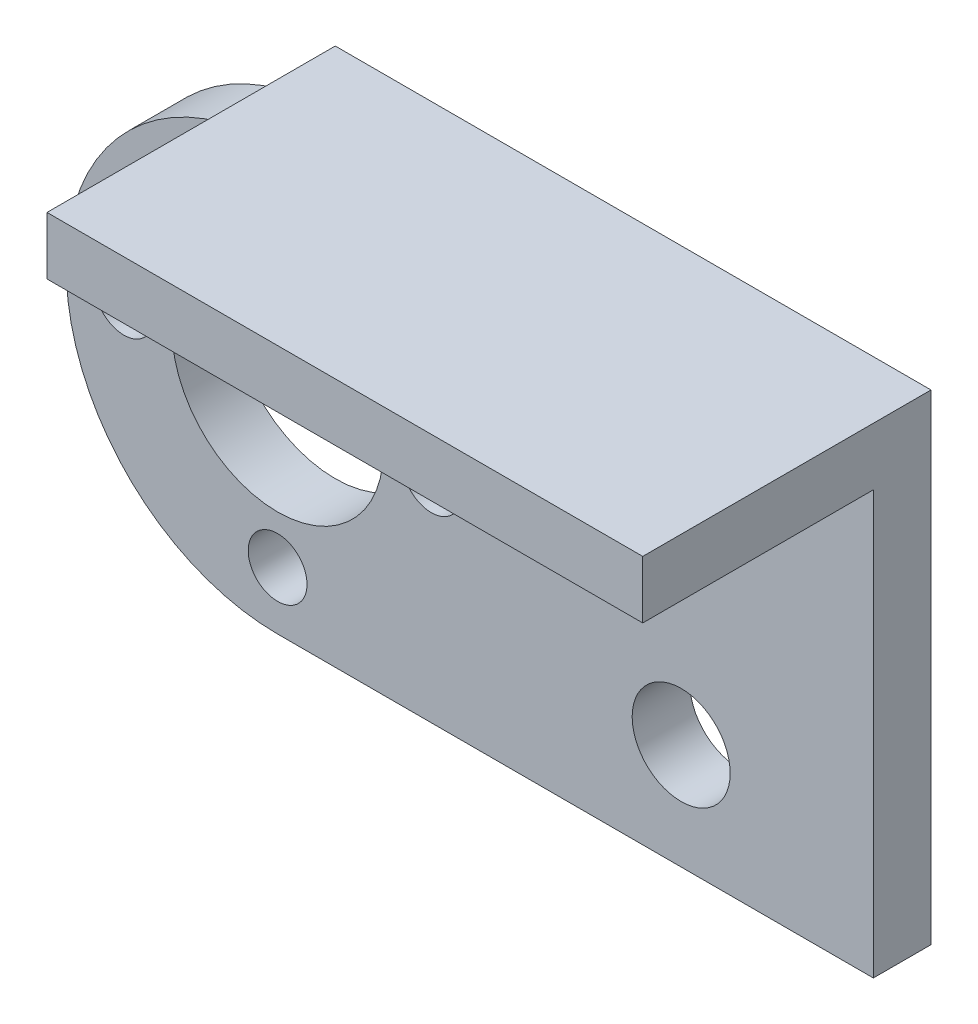
ISO-10303-21;
HEADER;
FILE_DESCRIPTION(('STEP AP214'),'2;1');
FILE_NAME('part.step','',(''),(''),'','','');
FILE_SCHEMA(('AUTOMOTIVE_DESIGN { 1 0 10303 214 1 1 1 1 }'));
ENDSEC;
DATA;
#1=APPLICATION_CONTEXT('core data for automotive mechanical design processes');
#2=APPLICATION_PROTOCOL_DEFINITION('international standard','automotive_design',2000,#1);
#3=PRODUCT_CONTEXT('',#1,'mechanical');
#4=PRODUCT('Part','Part','',(#3));
#5=PRODUCT_RELATED_PRODUCT_CATEGORY('part','',(#4));
#6=PRODUCT_DEFINITION_FORMATION('','',#4);
#7=PRODUCT_DEFINITION_CONTEXT('part definition',#1,'design');
#8=PRODUCT_DEFINITION('design','',#6,#7);
#9=PRODUCT_DEFINITION_SHAPE('','',#8);
#10=(LENGTH_UNIT() NAMED_UNIT(*) SI_UNIT(.MILLI.,.METRE.));
#11=(NAMED_UNIT(*) PLANE_ANGLE_UNIT() SI_UNIT($,.RADIAN.));
#12=(NAMED_UNIT(*) SI_UNIT($,.STERADIAN.) SOLID_ANGLE_UNIT());
#13=UNCERTAINTY_MEASURE_WITH_UNIT(LENGTH_MEASURE(1.E-05),#10,'distance_accuracy_value','');
#14=(GEOMETRIC_REPRESENTATION_CONTEXT(3) GLOBAL_UNCERTAINTY_ASSIGNED_CONTEXT((#13)) GLOBAL_UNIT_ASSIGNED_CONTEXT((#10,
#11,#12)) REPRESENTATION_CONTEXT('',''));
#15=CARTESIAN_POINT('',(0.,0.,0.));
#16=DIRECTION('',(0.,0.,1.));
#17=DIRECTION('',(1.,0.,0.));
#18=AXIS2_PLACEMENT_3D('',#15,#16,#17);
#19=CARTESIAN_POINT('',(0.,0.,3.));
#20=DIRECTION('',(0.,0.,1.));
#21=DIRECTION('',(1.,0.,0.));
#22=AXIS2_PLACEMENT_3D('',#19,#20,#21);
#23=PLANE('',#22);
#24=CARTESIAN_POINT('',(21.,5.5,3.));
#25=DIRECTION('',(0.,0.,1.));
#26=DIRECTION('',(1.,0.,0.));
#27=AXIS2_PLACEMENT_3D('',#24,#25,#26);
#28=CIRCLE('',#27,2.55);
#29=CARTESIAN_POINT('',(23.55,5.5,3.));
#30=VERTEX_POINT('',#29);
#31=EDGE_CURVE('E144',#30,#30,#28,.F.);
#32=ORIENTED_EDGE('',*,*,#31,.T.);
#33=EDGE_LOOP('',(#32));
#34=FACE_BOUND('',#33,.T.);
#35=CARTESIAN_POINT('',(21.,-5.5,3.));
#36=DIRECTION('',(0.,0.,1.));
#37=DIRECTION('',(1.,0.,0.));
#38=AXIS2_PLACEMENT_3D('',#35,#36,#37);
#39=CIRCLE('',#38,2.55);
#40=CARTESIAN_POINT('',(23.55,-5.5,3.));
#41=VERTEX_POINT('',#40);
#42=EDGE_CURVE('E140',#41,#41,#39,.F.);
#43=ORIENTED_EDGE('',*,*,#42,.T.);
#44=EDGE_LOOP('',(#43));
#45=FACE_BOUND('',#44,.T.);
#46=CARTESIAN_POINT('',(4.52787916007828E-13,-8.,3.));
#47=DIRECTION('',(0.,0.,1.));
#48=DIRECTION('',(1.,0.,0.));
#49=AXIS2_PLACEMENT_3D('',#46,#47,#48);
#50=CIRCLE('',#49,1.53000000000049);
#51=CARTESIAN_POINT('',(1.53000000000094,-8.,3.));
#52=VERTEX_POINT('',#51);
#53=EDGE_CURVE('E154',#52,#52,#50,.T.);
#54=ORIENTED_EDGE('',*,*,#53,.F.);
#55=EDGE_LOOP('',(#54));
#56=FACE_BOUND('',#55,.T.);
#57=CARTESIAN_POINT('',(0.,0.,3.));
#58=DIRECTION('',(0.,0.,1.));
#59=DIRECTION('',(1.,0.,0.));
#60=AXIS2_PLACEMENT_3D('',#57,#58,#59);
#61=CIRCLE('',#60,5.5);
#62=CARTESIAN_POINT('',(5.5,0.,3.));
#63=VERTEX_POINT('',#62);
#64=EDGE_CURVE('E166',#63,#63,#61,.T.);
#65=ORIENTED_EDGE('',*,*,#64,.F.);
#66=EDGE_LOOP('',(#65));
#67=FACE_BOUND('',#66,.T.);
#68=DIRECTION('',(-1.,0.,0.));
#69=VECTOR('',#68,1.);
#70=CARTESIAN_POINT('',(11.,11.,3.));
#71=LINE('',#70,#69);
#72=CARTESIAN_POINT('',(31.,11.,3.));
#73=VERTEX_POINT('',#72);
#74=CARTESIAN_POINT('',(-1.,11.,3.));
#75=VERTEX_POINT('',#74);
#76=EDGE_CURVE('E61',#73,#75,#71,.T.);
#77=ORIENTED_EDGE('',*,*,#76,.T.);
#78=DIRECTION('',(0.,-1.,0.));
#79=VECTOR('',#78,1.);
#80=CARTESIAN_POINT('',(-1.,0.,3.));
#81=LINE('',#80,#79);
#82=CARTESIAN_POINT('',(-0.999999999999999,11.7881900181363,3.));
#83=VERTEX_POINT('',#82);
#84=EDGE_CURVE('E204',#75,#83,#81,.F.);
#85=ORIENTED_EDGE('',*,*,#84,.T.);
#86=CARTESIAN_POINT('',(-3.97296347522982,14.4642857142857,3.));
#87=DIRECTION('',(0.,0.,1.));
#88=DIRECTION('',(1.,0.,0.));
#89=AXIS2_PLACEMENT_3D('',#86,#87,#88);
#90=CIRCLE('',#89,4.);
#91=CARTESIAN_POINT('',(-2.91350654850187,10.6071428571429,3.));
#92=VERTEX_POINT('',#91);
#93=EDGE_CURVE('E199',#83,#92,#90,.F.);
#94=ORIENTED_EDGE('',*,*,#93,.T.);
#95=CARTESIAN_POINT('',(0.,0.,3.));
#96=DIRECTION('',(0.,0.,1.));
#97=DIRECTION('',(1.,0.,0.));
#98=AXIS2_PLACEMENT_3D('',#95,#96,#97);
#99=CIRCLE('',#98,11.);
#100=CARTESIAN_POINT('',(0.,-11.,3.));
#101=VERTEX_POINT('',#100);
#102=EDGE_CURVE('E178',#92,#101,#99,.T.);
#103=ORIENTED_EDGE('',*,*,#102,.T.);
#104=DIRECTION('',(1.,0.,0.));
#105=VECTOR('',#104,1.);
#106=CARTESIAN_POINT('',(0.,-11.,3.));
#107=LINE('',#106,#105);
#108=CARTESIAN_POINT('',(31.,-11.,3.));
#109=VERTEX_POINT('',#108);
#110=EDGE_CURVE('E180',#101,#109,#107,.T.);
#111=ORIENTED_EDGE('',*,*,#110,.T.);
#112=DIRECTION('',(0.,1.,0.));
#113=VECTOR('',#112,1.);
#114=CARTESIAN_POINT('',(31.,-11.,3.));
#115=LINE('',#114,#113);
#116=EDGE_CURVE('E182',#109,#73,#115,.T.);
#117=ORIENTED_EDGE('',*,*,#116,.T.);
#118=EDGE_LOOP('',(#77,#85,#94,#103,#111,#117));
#119=FACE_BOUND('',#118,.T.);
#120=CARTESIAN_POINT('',(0.,8.,3.));
#121=DIRECTION('',(0.,0.,1.));
#122=DIRECTION('',(1.,0.,0.));
#123=AXIS2_PLACEMENT_3D('',#120,#121,#122);
#124=CIRCLE('',#123,1.53);
#125=CARTESIAN_POINT('',(1.53,8.,3.));
#126=VERTEX_POINT('',#125);
#127=EDGE_CURVE('E172',#126,#126,#124,.T.);
#128=ORIENTED_EDGE('',*,*,#127,.F.);
#129=EDGE_LOOP('',(#128));
#130=FACE_BOUND('',#129,.T.);
#131=CARTESIAN_POINT('',(8.,0.,3.));
#132=DIRECTION('',(0.,0.,1.));
#133=DIRECTION('',(1.,0.,0.));
#134=AXIS2_PLACEMENT_3D('',#131,#132,#133);
#135=CIRCLE('',#134,1.53);
#136=CARTESIAN_POINT('',(9.53,0.,3.));
#137=VERTEX_POINT('',#136);
#138=EDGE_CURVE('E160',#137,#137,#135,.T.);
#139=ORIENTED_EDGE('',*,*,#138,.F.);
#140=EDGE_LOOP('',(#139));
#141=FACE_BOUND('',#140,.T.);
#142=CARTESIAN_POINT('',(-8.,0.,3.));
#143=DIRECTION('',(0.,0.,1.));
#144=DIRECTION('',(1.,0.,0.));
#145=AXIS2_PLACEMENT_3D('',#142,#143,#144);
#146=CIRCLE('',#145,1.53);
#147=CARTESIAN_POINT('',(-6.47,0.,3.));
#148=VERTEX_POINT('',#147);
#149=EDGE_CURVE('E148',#148,#148,#146,.T.);
#150=ORIENTED_EDGE('',*,*,#149,.F.);
#151=EDGE_LOOP('',(#150));
#152=FACE_BOUND('',#151,.T.);
#153=ADVANCED_FACE('F33',(#34,#45,#56,#67,#119,#130,#141,#152),#23,.T.);
#154=CARTESIAN_POINT('',(0.,0.,0.));
#155=DIRECTION('',(0.,0.,1.));
#156=DIRECTION('',(1.,0.,0.));
#157=AXIS2_PLACEMENT_3D('',#154,#155,#156);
#158=PLANE('',#157);
#159=CARTESIAN_POINT('',(21.,5.5,0.));
#160=DIRECTION('',(0.,0.,1.));
#161=DIRECTION('',(1.,0.,0.));
#162=AXIS2_PLACEMENT_3D('',#159,#160,#161);
#163=CIRCLE('',#162,2.55);
#164=CARTESIAN_POINT('',(23.55,5.5,0.));
#165=VERTEX_POINT('',#164);
#166=EDGE_CURVE('E134',#165,#165,#163,.T.);
#167=ORIENTED_EDGE('',*,*,#166,.T.);
#168=EDGE_LOOP('',(#167));
#169=FACE_BOUND('',#168,.T.);
#170=CARTESIAN_POINT('',(21.,-5.5,0.));
#171=DIRECTION('',(0.,0.,1.));
#172=DIRECTION('',(-1.,0.,0.));
#173=AXIS2_PLACEMENT_3D('',#170,#171,#172);
#174=CIRCLE('',#173,2.55);
#175=CARTESIAN_POINT('',(18.45,-5.5,0.));
#176=VERTEX_POINT('',#175);
#177=EDGE_CURVE('E131',#176,#176,#174,.T.);
#178=ORIENTED_EDGE('',*,*,#177,.T.);
#179=EDGE_LOOP('',(#178));
#180=FACE_BOUND('',#179,.T.);
#181=CARTESIAN_POINT('',(0.,0.,0.));
#182=DIRECTION('',(0.,0.,1.));
#183=DIRECTION('',(1.,0.,0.));
#184=AXIS2_PLACEMENT_3D('',#181,#182,#183);
#185=CIRCLE('',#184,11.);
#186=CARTESIAN_POINT('',(-2.91350654850187,10.6071428571429,0.));
#187=VERTEX_POINT('',#186);
#188=CARTESIAN_POINT('',(0.,-11.,0.));
#189=VERTEX_POINT('',#188);
#190=EDGE_CURVE('E175',#187,#189,#185,.T.);
#191=ORIENTED_EDGE('',*,*,#190,.F.);
#192=CARTESIAN_POINT('',(-3.97296347522982,14.4642857142857,0.));
#193=DIRECTION('',(0.,0.,1.));
#194=DIRECTION('',(1.,0.,0.));
#195=AXIS2_PLACEMENT_3D('',#192,#193,#194);
#196=CIRCLE('',#195,4.);
#197=CARTESIAN_POINT('',(0.,14.,0.));
#198=VERTEX_POINT('',#197);
#199=EDGE_CURVE('E197',#187,#198,#196,.T.);
#200=ORIENTED_EDGE('',*,*,#199,.T.);
#201=DIRECTION('',(-1.,0.,0.));
#202=VECTOR('',#201,1.);
#203=CARTESIAN_POINT('',(31.,14.,0.));
#204=LINE('',#203,#202);
#205=CARTESIAN_POINT('',(31.,14.,0.));
#206=VERTEX_POINT('',#205);
#207=EDGE_CURVE('E124',#206,#198,#204,.T.);
#208=ORIENTED_EDGE('',*,*,#207,.F.);
#209=DIRECTION('',(0.,1.,0.));
#210=VECTOR('',#209,1.);
#211=CARTESIAN_POINT('',(31.,-11.,0.));
#212=LINE('',#211,#210);
#213=CARTESIAN_POINT('',(31.,-11.,0.));
#214=VERTEX_POINT('',#213);
#215=EDGE_CURVE('E129',#214,#206,#212,.T.);
#216=ORIENTED_EDGE('',*,*,#215,.F.);
#217=DIRECTION('',(1.,0.,0.));
#218=VECTOR('',#217,1.);
#219=CARTESIAN_POINT('',(11.,-11.,0.));
#220=LINE('',#219,#218);
#221=EDGE_CURVE('E187',#189,#214,#220,.T.);
#222=ORIENTED_EDGE('',*,*,#221,.F.);
#223=EDGE_LOOP('',(#191,#200,#208,#216,#222));
#224=FACE_BOUND('',#223,.T.);
#225=CARTESIAN_POINT('',(0.,8.,0.));
#226=DIRECTION('',(0.,0.,1.));
#227=DIRECTION('',(1.,0.,0.));
#228=AXIS2_PLACEMENT_3D('',#225,#226,#227);
#229=CIRCLE('',#228,1.53);
#230=CARTESIAN_POINT('',(1.53,8.,0.));
#231=VERTEX_POINT('',#230);
#232=EDGE_CURVE('E169',#231,#231,#229,.T.);
#233=ORIENTED_EDGE('',*,*,#232,.T.);
#234=EDGE_LOOP('',(#233));
#235=FACE_BOUND('',#234,.T.);
#236=CARTESIAN_POINT('',(0.,0.,0.));
#237=DIRECTION('',(0.,0.,1.));
#238=DIRECTION('',(1.,0.,0.));
#239=AXIS2_PLACEMENT_3D('',#236,#237,#238);
#240=CIRCLE('',#239,5.5);
#241=CARTESIAN_POINT('',(5.5,0.,0.));
#242=VERTEX_POINT('',#241);
#243=EDGE_CURVE('E163',#242,#242,#240,.T.);
#244=ORIENTED_EDGE('',*,*,#243,.T.);
#245=EDGE_LOOP('',(#244));
#246=FACE_BOUND('',#245,.T.);
#247=CARTESIAN_POINT('',(8.,0.,0.));
#248=DIRECTION('',(0.,0.,1.));
#249=DIRECTION('',(1.,0.,0.));
#250=AXIS2_PLACEMENT_3D('',#247,#248,#249);
#251=CIRCLE('',#250,1.53);
#252=CARTESIAN_POINT('',(9.53,0.,0.));
#253=VERTEX_POINT('',#252);
#254=EDGE_CURVE('E157',#253,#253,#251,.T.);
#255=ORIENTED_EDGE('',*,*,#254,.T.);
#256=EDGE_LOOP('',(#255));
#257=FACE_BOUND('',#256,.T.);
#258=CARTESIAN_POINT('',(4.52787916007828E-13,-8.,0.));
#259=DIRECTION('',(0.,0.,1.));
#260=DIRECTION('',(1.,0.,0.));
#261=AXIS2_PLACEMENT_3D('',#258,#259,#260);
#262=CIRCLE('',#261,1.53000000000049);
#263=CARTESIAN_POINT('',(1.53000000000094,-8.,0.));
#264=VERTEX_POINT('',#263);
#265=EDGE_CURVE('E151',#264,#264,#262,.T.);
#266=ORIENTED_EDGE('',*,*,#265,.T.);
#267=EDGE_LOOP('',(#266));
#268=FACE_BOUND('',#267,.T.);
#269=CARTESIAN_POINT('',(-8.,0.,0.));
#270=DIRECTION('',(0.,0.,1.));
#271=DIRECTION('',(1.,0.,0.));
#272=AXIS2_PLACEMENT_3D('',#269,#270,#271);
#273=CIRCLE('',#272,1.53);
#274=CARTESIAN_POINT('',(-6.47,0.,0.));
#275=VERTEX_POINT('',#274);
#276=EDGE_CURVE('E147',#275,#275,#273,.T.);
#277=ORIENTED_EDGE('',*,*,#276,.T.);
#278=EDGE_LOOP('',(#277));
#279=FACE_BOUND('',#278,.T.);
#280=ADVANCED_FACE('F226',(#169,#180,#224,#235,#246,#257,#268,#279),#158,.F.);
#281=CARTESIAN_POINT('',(0.,0.,3.));
#282=DIRECTION('',(0.,0.,-1.));
#283=DIRECTION('',(-1.,0.,0.));
#284=AXIS2_PLACEMENT_3D('',#281,#282,#283);
#285=CYLINDRICAL_SURFACE('',#284,11.);
#286=ORIENTED_EDGE('',*,*,#102,.F.);
#287=DIRECTION('',(0.,0.,-1.));
#288=VECTOR('',#287,1.);
#289=CARTESIAN_POINT('',(-2.91350654850187,10.6071428571429,3.));
#290=LINE('',#289,#288);
#291=EDGE_CURVE('E194',#92,#187,#290,.T.);
#292=ORIENTED_EDGE('',*,*,#291,.T.);
#293=ORIENTED_EDGE('',*,*,#190,.T.);
#294=DIRECTION('',(0.,0.,-1.));
#295=VECTOR('',#294,1.);
#296=CARTESIAN_POINT('',(0.,-11.,3.));
#297=LINE('',#296,#295);
#298=EDGE_CURVE('E191',#101,#189,#297,.T.);
#299=ORIENTED_EDGE('',*,*,#298,.F.);
#300=EDGE_LOOP('',(#286,#292,#293,#299));
#301=FACE_BOUND('',#300,.T.);
#302=ADVANCED_FACE('F222',(#301),#285,.T.);
#303=CARTESIAN_POINT('',(11.,-11.,3.));
#304=DIRECTION('',(0.,1.,0.));
#305=DIRECTION('',(0.,0.,1.));
#306=AXIS2_PLACEMENT_3D('',#303,#304,#305);
#307=PLANE('',#306);
#308=ORIENTED_EDGE('',*,*,#221,.T.);
#309=DIRECTION('',(0.,0.,-1.));
#310=VECTOR('',#309,1.);
#311=CARTESIAN_POINT('',(31.,-11.,3.));
#312=LINE('',#311,#310);
#313=EDGE_CURVE('E185',#109,#214,#312,.T.);
#314=ORIENTED_EDGE('',*,*,#313,.F.);
#315=ORIENTED_EDGE('',*,*,#110,.F.);
#316=ORIENTED_EDGE('',*,*,#298,.T.);
#317=EDGE_LOOP('',(#308,#314,#315,#316));
#318=FACE_BOUND('',#317,.T.);
#319=ADVANCED_FACE('F231',(#318),#307,.F.);
#320=CARTESIAN_POINT('',(31.,-11.,3.));
#321=DIRECTION('',(-1.,0.,0.));
#322=DIRECTION('',(0.,0.,1.));
#323=AXIS2_PLACEMENT_3D('',#320,#321,#322);
#324=PLANE('',#323);
#325=ORIENTED_EDGE('',*,*,#215,.T.);
#326=DIRECTION('',(0.,0.,-1.));
#327=VECTOR('',#326,1.);
#328=CARTESIAN_POINT('',(31.,14.,15.));
#329=LINE('',#328,#327);
#330=CARTESIAN_POINT('',(31.,14.,15.));
#331=VERTEX_POINT('',#330);
#332=EDGE_CURVE('E110',#331,#206,#329,.T.);
#333=ORIENTED_EDGE('',*,*,#332,.F.);
#334=DIRECTION('',(0.,1.,0.));
#335=VECTOR('',#334,1.);
#336=CARTESIAN_POINT('',(31.,11.,15.));
#337=LINE('',#336,#335);
#338=CARTESIAN_POINT('',(31.,11.,15.));
#339=VERTEX_POINT('',#338);
#340=EDGE_CURVE('E115',#339,#331,#337,.T.);
#341=ORIENTED_EDGE('',*,*,#340,.F.);
#342=DIRECTION('',(0.,0.,-1.));
#343=VECTOR('',#342,1.);
#344=CARTESIAN_POINT('',(31.,11.,15.));
#345=LINE('',#344,#343);
#346=EDGE_CURVE('E233',#339,#73,#345,.T.);
#347=ORIENTED_EDGE('',*,*,#346,.T.);
#348=ORIENTED_EDGE('',*,*,#116,.F.);
#349=ORIENTED_EDGE('',*,*,#313,.T.);
#350=EDGE_LOOP('',(#325,#333,#341,#347,#348,#349));
#351=FACE_BOUND('',#350,.T.);
#352=ADVANCED_FACE('F126',(#351),#324,.F.);
#353=CARTESIAN_POINT('',(0.,8.,3.));
#354=DIRECTION('',(0.,0.,-1.));
#355=DIRECTION('',(-1.,0.,0.));
#356=AXIS2_PLACEMENT_3D('',#353,#354,#355);
#357=CYLINDRICAL_SURFACE('',#356,1.53);
#358=ORIENTED_EDGE('',*,*,#127,.T.);
#359=EDGE_LOOP('',(#358));
#360=FACE_BOUND('',#359,.T.);
#361=ORIENTED_EDGE('',*,*,#232,.F.);
#362=EDGE_LOOP('',(#361));
#363=FACE_BOUND('',#362,.T.);
#364=ADVANCED_FACE('F259',(#360,#363),#357,.F.);
#365=CARTESIAN_POINT('',(0.,0.,3.));
#366=DIRECTION('',(0.,0.,-1.));
#367=DIRECTION('',(-1.,0.,0.));
#368=AXIS2_PLACEMENT_3D('',#365,#366,#367);
#369=CYLINDRICAL_SURFACE('',#368,5.5);
#370=ORIENTED_EDGE('',*,*,#64,.T.);
#371=EDGE_LOOP('',(#370));
#372=FACE_BOUND('',#371,.T.);
#373=ORIENTED_EDGE('',*,*,#243,.F.);
#374=EDGE_LOOP('',(#373));
#375=FACE_BOUND('',#374,.T.);
#376=ADVANCED_FACE('F383',(#372,#375),#369,.F.);
#377=CARTESIAN_POINT('',(8.,0.,3.));
#378=DIRECTION('',(0.,0.,-1.));
#379=DIRECTION('',(-1.,0.,0.));
#380=AXIS2_PLACEMENT_3D('',#377,#378,#379);
#381=CYLINDRICAL_SURFACE('',#380,1.53);
#382=ORIENTED_EDGE('',*,*,#138,.T.);
#383=EDGE_LOOP('',(#382));
#384=FACE_BOUND('',#383,.T.);
#385=ORIENTED_EDGE('',*,*,#254,.F.);
#386=EDGE_LOOP('',(#385));
#387=FACE_BOUND('',#386,.T.);
#388=ADVANCED_FACE('F373',(#384,#387),#381,.F.);
#389=CARTESIAN_POINT('',(4.52787916007828E-13,-8.,3.));
#390=DIRECTION('',(0.,0.,-1.));
#391=DIRECTION('',(-1.,0.,0.));
#392=AXIS2_PLACEMENT_3D('',#389,#390,#391);
#393=CYLINDRICAL_SURFACE('',#392,1.53000000000049);
#394=ORIENTED_EDGE('',*,*,#53,.T.);
#395=EDGE_LOOP('',(#394));
#396=FACE_BOUND('',#395,.T.);
#397=ORIENTED_EDGE('',*,*,#265,.F.);
#398=EDGE_LOOP('',(#397));
#399=FACE_BOUND('',#398,.T.);
#400=ADVANCED_FACE('F363',(#396,#399),#393,.F.);
#401=CARTESIAN_POINT('',(-8.,0.,3.));
#402=DIRECTION('',(0.,0.,-1.));
#403=DIRECTION('',(-1.,0.,0.));
#404=AXIS2_PLACEMENT_3D('',#401,#402,#403);
#405=CYLINDRICAL_SURFACE('',#404,1.53);
#406=ORIENTED_EDGE('',*,*,#149,.T.);
#407=EDGE_LOOP('',(#406));
#408=FACE_BOUND('',#407,.T.);
#409=ORIENTED_EDGE('',*,*,#276,.F.);
#410=EDGE_LOOP('',(#409));
#411=FACE_BOUND('',#410,.T.);
#412=ADVANCED_FACE('F353',(#408,#411),#405,.F.);
#413=CARTESIAN_POINT('',(21.,-5.5,10.));
#414=DIRECTION('',(0.,0.,-1.));
#415=DIRECTION('',(-1.,0.,0.));
#416=AXIS2_PLACEMENT_3D('',#413,#414,#415);
#417=CYLINDRICAL_SURFACE('',#416,2.55);
#418=ORIENTED_EDGE('',*,*,#42,.F.);
#419=EDGE_LOOP('',(#418));
#420=FACE_BOUND('',#419,.T.);
#421=ORIENTED_EDGE('',*,*,#177,.F.);
#422=EDGE_LOOP('',(#421));
#423=FACE_BOUND('',#422,.T.);
#424=ADVANCED_FACE('F346',(#420,#423),#417,.F.);
#425=CARTESIAN_POINT('',(21.,5.5,10.));
#426=DIRECTION('',(0.,0.,-1.));
#427=DIRECTION('',(-1.,0.,0.));
#428=AXIS2_PLACEMENT_3D('',#425,#426,#427);
#429=CYLINDRICAL_SURFACE('',#428,2.55);
#430=ORIENTED_EDGE('',*,*,#31,.F.);
#431=EDGE_LOOP('',(#430));
#432=FACE_BOUND('',#431,.T.);
#433=ORIENTED_EDGE('',*,*,#166,.F.);
#434=EDGE_LOOP('',(#433));
#435=FACE_BOUND('',#434,.T.);
#436=ADVANCED_FACE('F247',(#432,#435),#429,.F.);
#437=CARTESIAN_POINT('',(31.,14.,15.));
#438=DIRECTION('',(0.,-1.,0.));
#439=DIRECTION('',(1.,0.,0.));
#440=AXIS2_PLACEMENT_3D('',#437,#438,#439);
#441=PLANE('',#440);
#442=ORIENTED_EDGE('',*,*,#207,.T.);
#443=DIRECTION('',(0.,0.,-1.));
#444=VECTOR('',#443,1.);
#445=CARTESIAN_POINT('',(0.,14.,15.));
#446=LINE('',#445,#444);
#447=CARTESIAN_POINT('',(0.,14.,4.));
#448=VERTEX_POINT('',#447);
#449=EDGE_CURVE('E53',#448,#198,#446,.T.);
#450=ORIENTED_EDGE('',*,*,#449,.F.);
#451=CARTESIAN_POINT('',(0.,14.,15.));
#452=VERTEX_POINT('',#451);
#453=EDGE_CURVE('E111',#452,#448,#446,.T.);
#454=ORIENTED_EDGE('',*,*,#453,.F.);
#455=DIRECTION('',(-1.,0.,0.));
#456=VECTOR('',#455,1.);
#457=CARTESIAN_POINT('',(31.,14.,15.));
#458=LINE('',#457,#456);
#459=EDGE_CURVE('E106',#331,#452,#458,.T.);
#460=ORIENTED_EDGE('',*,*,#459,.F.);
#461=ORIENTED_EDGE('',*,*,#332,.T.);
#462=EDGE_LOOP('',(#442,#450,#454,#460,#461));
#463=FACE_BOUND('',#462,.T.);
#464=ADVANCED_FACE('F108',(#463),#441,.F.);
#465=CARTESIAN_POINT('',(0.,11.,15.));
#466=DIRECTION('',(1.,0.,0.));
#467=DIRECTION('',(0.,1.,0.));
#468=AXIS2_PLACEMENT_3D('',#465,#466,#467);
#469=PLANE('',#468);
#470=ORIENTED_EDGE('',*,*,#453,.T.);
#471=DIRECTION('',(0.,-1.,0.));
#472=VECTOR('',#471,1.);
#473=CARTESIAN_POINT('',(0.,11.,4.));
#474=LINE('',#473,#472);
#475=CARTESIAN_POINT('',(0.,11.,4.));
#476=VERTEX_POINT('',#475);
#477=EDGE_CURVE('E201',#448,#476,#474,.T.);
#478=ORIENTED_EDGE('',*,*,#477,.T.);
#479=DIRECTION('',(0.,0.,-1.));
#480=VECTOR('',#479,1.);
#481=CARTESIAN_POINT('',(0.,11.,15.));
#482=LINE('',#481,#480);
#483=CARTESIAN_POINT('',(0.,11.,15.));
#484=VERTEX_POINT('',#483);
#485=EDGE_CURVE('E210',#484,#476,#482,.T.);
#486=ORIENTED_EDGE('',*,*,#485,.F.);
#487=DIRECTION('',(0.,-1.,0.));
#488=VECTOR('',#487,1.);
#489=CARTESIAN_POINT('',(0.,11.,15.));
#490=LINE('',#489,#488);
#491=EDGE_CURVE('E114',#452,#484,#490,.T.);
#492=ORIENTED_EDGE('',*,*,#491,.F.);
#493=EDGE_LOOP('',(#470,#478,#486,#492));
#494=FACE_BOUND('',#493,.T.);
#495=ADVANCED_FACE('F239',(#494),#469,.F.);
#496=CARTESIAN_POINT('',(31.,11.,15.));
#497=DIRECTION('',(0.,1.,0.));
#498=DIRECTION('',(0.,0.,1.));
#499=AXIS2_PLACEMENT_3D('',#496,#497,#498);
#500=PLANE('',#499);
#501=ORIENTED_EDGE('',*,*,#76,.F.);
#502=ORIENTED_EDGE('',*,*,#346,.F.);
#503=DIRECTION('',(1.,0.,0.));
#504=VECTOR('',#503,1.);
#505=CARTESIAN_POINT('',(31.,11.,15.));
#506=LINE('',#505,#504);
#507=EDGE_CURVE('E120',#484,#339,#506,.T.);
#508=ORIENTED_EDGE('',*,*,#507,.F.);
#509=ORIENTED_EDGE('',*,*,#485,.T.);
#510=CARTESIAN_POINT('',(-1.,11.,4.));
#511=DIRECTION('',(0.,1.,0.));
#512=DIRECTION('',(0.,0.,1.));
#513=AXIS2_PLACEMENT_3D('',#510,#511,#512);
#514=CIRCLE('',#513,1.);
#515=EDGE_CURVE('E46',#476,#75,#514,.T.);
#516=ORIENTED_EDGE('',*,*,#515,.T.);
#517=EDGE_LOOP('',(#501,#502,#508,#509,#516));
#518=FACE_BOUND('',#517,.T.);
#519=ADVANCED_FACE('F208',(#518),#500,.F.);
#520=CARTESIAN_POINT('',(0.,0.,15.));
#521=DIRECTION('',(0.,0.,1.));
#522=DIRECTION('',(1.,0.,0.));
#523=AXIS2_PLACEMENT_3D('',#520,#521,#522);
#524=PLANE('',#523);
#525=ORIENTED_EDGE('',*,*,#340,.T.);
#526=ORIENTED_EDGE('',*,*,#459,.T.);
#527=ORIENTED_EDGE('',*,*,#491,.T.);
#528=ORIENTED_EDGE('',*,*,#507,.T.);
#529=EDGE_LOOP('',(#525,#526,#527,#528));
#530=FACE_BOUND('',#529,.T.);
#531=ADVANCED_FACE('F118',(#530),#524,.T.);
#532=CARTESIAN_POINT('',(-3.97296347522982,14.4642857142857,15.));
#533=DIRECTION('',(0.,0.,1.));
#534=DIRECTION('',(1.,0.,0.));
#535=AXIS2_PLACEMENT_3D('',#532,#533,#534);
#536=CYLINDRICAL_SURFACE('',#535,4.);
#537=ORIENTED_EDGE('',*,*,#93,.F.);
#538=CARTESIAN_POINT('',(-1.,11.7881900181363,3.));
#539=CARTESIAN_POINT('',(-0.957310418923033,11.8356009167763,3.0000209547865));
#540=CARTESIAN_POINT('',(-0.915810892513156,11.8839991749135,3.00273110803888));
#541=CARTESIAN_POINT('',(-0.835455989510756,11.9823408555421,3.01279621347713));
#542=CARTESIAN_POINT('',(-0.796595901042265,12.0322812799661,3.02014263407977));
#543=CARTESIAN_POINT('',(-0.72180509795973,12.1332123451827,3.03870758929789));
#544=CARTESIAN_POINT('',(-0.685861265555409,12.1841968229267,3.04990744230809));
#545=CARTESIAN_POINT('',(-0.616736712577769,12.2872252737632,3.07562452051424));
#546=CARTESIAN_POINT('',(-0.583557706533387,12.3392698797369,3.09014378356475));
#547=CARTESIAN_POINT('',(-0.503566118362082,12.4713137410621,3.13025054361946));
#548=CARTESIAN_POINT('',(-0.458569939069338,12.5518588791733,3.15768013093723));
#549=CARTESIAN_POINT('',(-0.374920906932876,12.7143017768313,3.21774103129759));
#550=CARTESIAN_POINT('',(-0.336271146003331,12.7962001744143,3.25037486462773));
#551=CARTESIAN_POINT('',(-0.265112976600694,12.9609850156437,3.3199840503664));
#552=CARTESIAN_POINT('',(-0.232614930350792,13.0438728807354,3.35696656100194));
#553=CARTESIAN_POINT('',(-0.173687194806251,13.2099915535078,3.43467625818262));
#554=CARTESIAN_POINT('',(-0.147254175123376,13.2932221473079,3.47540137232317));
#555=CARTESIAN_POINT('',(-0.112098950843844,13.4175899042792,3.53933044322277));
#556=CARTESIAN_POINT('',(-0.101149870063037,13.4588707239201,3.5610599158125));
#557=CARTESIAN_POINT('',(-0.0807135442224716,13.5411475137918,3.60564580655402));
#558=CARTESIAN_POINT('',(-0.071225185100598,13.5821436781059,3.62850134813719));
#559=CARTESIAN_POINT('',(-0.0566210098354129,13.650017785669,3.66785791286787));
#560=CARTESIAN_POINT('',(-0.0511014679080348,13.6770498784658,3.68393975928812));
#561=CARTESIAN_POINT('',(-0.0407234301058982,13.730639916487,3.71700449698154));
#562=CARTESIAN_POINT('',(-0.0358643239558664,13.7571982794684,3.73398653597856));
#563=CARTESIAN_POINT('',(-0.0253277090051286,13.818220642484,3.77502852610377));
#564=CARTESIAN_POINT('',(-0.0199039366568872,13.8524228042737,3.79958404707196));
#565=CARTESIAN_POINT('',(-0.0127702505160171,13.9011255550358,3.84011123468917));
#566=CARTESIAN_POINT('',(-0.0105499730844298,13.9170062811756,3.85432435322874));
#567=CARTESIAN_POINT('',(-0.00654520872130393,13.9468459952678,3.88473801313493));
#568=CARTESIAN_POINT('',(-0.00475846734143162,13.9608147526504,3.90092758494737));
#569=CARTESIAN_POINT('',(-0.00274000489134293,13.9771010221533,3.92569928815018));
#570=CARTESIAN_POINT('',(-0.00222174991802274,13.9813523622472,3.93295297661148));
#571=CARTESIAN_POINT('',(-0.00132605035387086,13.9887758210593,3.94797302293289));
#572=CARTESIAN_POINT('',(-0.000947855530612237,13.9919536815744,3.95573637913003));
#573=CARTESIAN_POINT('',(-0.000446383740466251,13.9961922054831,3.96956464996557));
#574=CARTESIAN_POINT('',(-0.000281843975074983,13.9975928886393,3.97552193020221));
#575=CARTESIAN_POINT('',(-5.73347918435563E-05,13.9995092921486,3.98764571180526));
#576=CARTESIAN_POINT('',(1.42976574830471E-06,14.0000148149023,3.99381381820171));
#577=CARTESIAN_POINT('',(0.,14.,4.));
#578=B_SPLINE_CURVE_WITH_KNOTS('',3,(#538,#539,#540,#541,#542,#543,#544,#545,#546,#547,#548,
#549,#550,#551,#552,#553,#554,#555,#556,#557,#558,#559,#560,#561,#562,#563,#564,#565,#566,#567,
#568,#569,#570,#571,#572,#573,#574,#575,#576,#577),.UNSPECIFIED.,.F.,.F.,(4,2,2,2,2,2,2,2,2,2,2,
2,2,2,2,2,2,2,2,4),(0.,0.191229858976569,0.382108841912741,0.572075178978952,0.762158454984652,
1.05048331560345,1.33894823121341,1.62789480844229,1.91668233943894,2.06040942707517,
2.20402634811112,2.29980582836238,2.39549619303255,2.52254917316895,2.58678500448466,
2.65067927540624,2.67589003184636,2.70096372365227,2.71926485554476,2.7377731629075),.UNSPECIFIED.);
#579=EDGE_CURVE('E11',#83,#448,#578,.T.);
#580=ORIENTED_EDGE('',*,*,#579,.T.);
#581=ORIENTED_EDGE('',*,*,#449,.T.);
#582=ORIENTED_EDGE('',*,*,#199,.F.);
#583=ORIENTED_EDGE('',*,*,#291,.F.);
#584=EDGE_LOOP('',(#537,#580,#581,#582,#583));
#585=FACE_BOUND('',#584,.T.);
#586=ADVANCED_FACE('F219',(#585),#536,.F.);
#587=CARTESIAN_POINT('',(-1.,11.,4.));
#588=DIRECTION('',(0.,-1.,0.));
#589=DIRECTION('',(1.,0.,0.));
#590=AXIS2_PLACEMENT_3D('',#587,#588,#589);
#591=CYLINDRICAL_SURFACE('',#590,1.);
#592=ORIENTED_EDGE('',*,*,#579,.F.);
#593=ORIENTED_EDGE('',*,*,#84,.F.);
#594=ORIENTED_EDGE('',*,*,#515,.F.);
#595=ORIENTED_EDGE('',*,*,#477,.F.);
#596=EDGE_LOOP('',(#592,#593,#594,#595));
#597=FACE_BOUND('',#596,.T.);
#598=ADVANCED_FACE('F35',(#597),#591,.F.);
#599=CLOSED_SHELL('',(#153,#280,#302,#319,#352,#364,#376,#388,#400,#412,#424,#436,#464,#495,
#519,#531,#586,#598));
#600=MANIFOLD_SOLID_BREP('B2',#599);
#601=ADVANCED_BREP_SHAPE_REPRESENTATION('',(#18,#600),#14);
#602=SHAPE_DEFINITION_REPRESENTATION(#9,#601);
ENDSEC;
END-ISO-10303-21;
